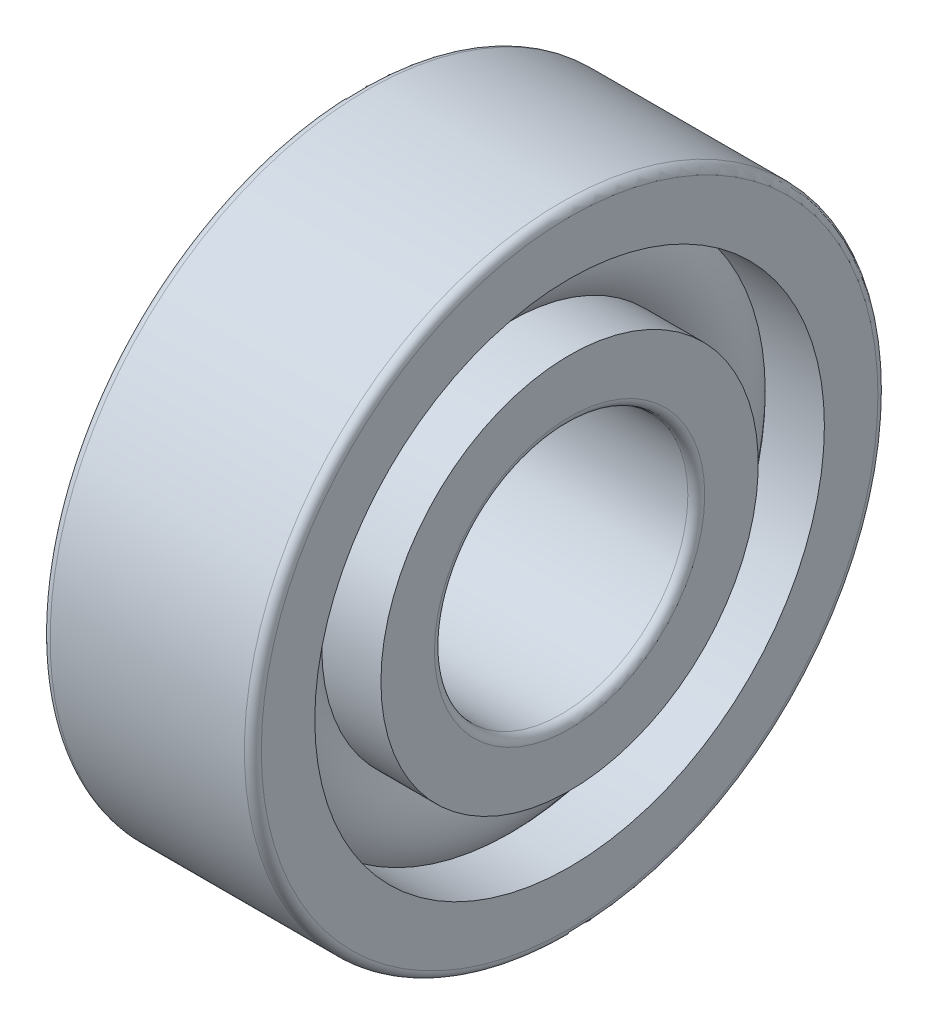
ISO-10303-21;
HEADER;
FILE_DESCRIPTION(('STEP AP214'),'2;1');
FILE_NAME('part.step','',(''),(''),'','','');
FILE_SCHEMA(('AUTOMOTIVE_DESIGN { 1 0 10303 214 1 1 1 1 }'));
ENDSEC;
DATA;
#1=APPLICATION_CONTEXT('core data for automotive mechanical design processes');
#2=APPLICATION_PROTOCOL_DEFINITION('international standard','automotive_design',2000,#1);
#3=PRODUCT_CONTEXT('',#1,'mechanical');
#4=PRODUCT('Part','Part','',(#3));
#5=PRODUCT_RELATED_PRODUCT_CATEGORY('part','',(#4));
#6=PRODUCT_DEFINITION_FORMATION('','',#4);
#7=PRODUCT_DEFINITION_CONTEXT('part definition',#1,'design');
#8=PRODUCT_DEFINITION('design','',#6,#7);
#9=PRODUCT_DEFINITION_SHAPE('','',#8);
#10=(LENGTH_UNIT() NAMED_UNIT(*) SI_UNIT(.MILLI.,.METRE.));
#11=(NAMED_UNIT(*) PLANE_ANGLE_UNIT() SI_UNIT($,.RADIAN.));
#12=(NAMED_UNIT(*) SI_UNIT($,.STERADIAN.) SOLID_ANGLE_UNIT());
#13=UNCERTAINTY_MEASURE_WITH_UNIT(LENGTH_MEASURE(1.E-05),#10,'distance_accuracy_value','');
#14=(GEOMETRIC_REPRESENTATION_CONTEXT(3) GLOBAL_UNCERTAINTY_ASSIGNED_CONTEXT((#13)) GLOBAL_UNIT_ASSIGNED_CONTEXT((#10,
#11,#12)) REPRESENTATION_CONTEXT('',''));
#15=CARTESIAN_POINT('',(0.,0.,0.));
#16=DIRECTION('',(0.,0.,1.));
#17=DIRECTION('',(1.,0.,0.));
#18=AXIS2_PLACEMENT_3D('',#15,#16,#17);
#19=CARTESIAN_POINT('',(2.5,0.,0.));
#20=DIRECTION('',(-1.,0.,0.));
#21=DIRECTION('',(0.,0.,1.));
#22=AXIS2_PLACEMENT_3D('',#19,#20,#21);
#23=TOROIDAL_SURFACE('',#22,5.25,1.35);
#24=CARTESIAN_POINT('',(3.599732240138,0.,0.));
#25=DIRECTION('',(-1.,0.,0.));
#26=DIRECTION('',(0.,0.,1.));
#27=AXIS2_PLACEMENT_3D('',#24,#25,#26);
#28=CIRCLE('',#27,4.467);
#29=CARTESIAN_POINT('',(3.599732240138,0.,4.467));
#30=VERTEX_POINT('',#29);
#31=EDGE_CURVE('P0_E38',#30,#30,#28,.F.);
#32=ORIENTED_EDGE('',*,*,#31,.F.);
#33=EDGE_LOOP('',(#32));
#34=FACE_BOUND('',#33,.T.);
#35=CARTESIAN_POINT('',(1.400267759862,0.,0.));
#36=DIRECTION('',(-1.,0.,0.));
#37=DIRECTION('',(0.,0.,1.));
#38=AXIS2_PLACEMENT_3D('',#35,#36,#37);
#39=CIRCLE('',#38,4.467);
#40=CARTESIAN_POINT('',(1.400267759862,0.,4.467));
#41=VERTEX_POINT('',#40);
#42=EDGE_CURVE('P0_E34',#41,#41,#39,.T.);
#43=ORIENTED_EDGE('',*,*,#42,.F.);
#44=EDGE_LOOP('',(#43));
#45=FACE_BOUND('',#44,.T.);
#46=ADVANCED_FACE('P0_F15',(#34,#45),#23,.F.);
#47=CARTESIAN_POINT('',(5.25,0.,0.));
#48=DIRECTION('',(-1.,0.,0.));
#49=DIRECTION('',(0.,0.,1.));
#50=AXIS2_PLACEMENT_3D('',#47,#48,#49);
#51=CYLINDRICAL_SURFACE('',#50,4.467);
#52=ORIENTED_EDGE('',*,*,#31,.T.);
#53=EDGE_LOOP('',(#52));
#54=FACE_BOUND('',#53,.T.);
#55=CARTESIAN_POINT('',(5.,0.,0.));
#56=DIRECTION('',(-1.,0.,0.));
#57=DIRECTION('',(0.,0.,1.));
#58=AXIS2_PLACEMENT_3D('',#55,#56,#57);
#59=CIRCLE('',#58,4.467);
#60=CARTESIAN_POINT('',(5.,0.,4.467));
#61=VERTEX_POINT('',#60);
#62=EDGE_CURVE('P0_E37',#61,#61,#59,.F.);
#63=ORIENTED_EDGE('',*,*,#62,.F.);
#64=EDGE_LOOP('',(#63));
#65=FACE_BOUND('',#64,.T.);
#66=ADVANCED_FACE('P0_F51',(#54,#65),#51,.T.);
#67=CARTESIAN_POINT('',(5.25,0.,0.));
#68=DIRECTION('',(-1.,0.,0.));
#69=DIRECTION('',(0.,0.,1.));
#70=AXIS2_PLACEMENT_3D('',#67,#68,#69);
#71=CYLINDRICAL_SURFACE('',#70,4.467);
#72=ORIENTED_EDGE('',*,*,#42,.T.);
#73=EDGE_LOOP('',(#72));
#74=FACE_BOUND('',#73,.T.);
#75=CARTESIAN_POINT('',(0.,0.,0.));
#76=DIRECTION('',(-1.,0.,0.));
#77=DIRECTION('',(0.,0.,1.));
#78=AXIS2_PLACEMENT_3D('',#75,#76,#77);
#79=CIRCLE('',#78,4.467);
#80=CARTESIAN_POINT('',(0.,0.,4.467));
#81=VERTEX_POINT('',#80);
#82=EDGE_CURVE('P0_E43',#81,#81,#79,.F.);
#83=ORIENTED_EDGE('',*,*,#82,.T.);
#84=EDGE_LOOP('',(#83));
#85=FACE_BOUND('',#84,.T.);
#86=ADVANCED_FACE('P0_F53',(#74,#85),#71,.T.);
#87=CARTESIAN_POINT('',(5.,0.,0.));
#88=DIRECTION('',(1.,0.,0.));
#89=DIRECTION('',(0.,0.,-1.));
#90=AXIS2_PLACEMENT_3D('',#87,#88,#89);
#91=PLANE('',#90);
#92=ORIENTED_EDGE('',*,*,#62,.T.);
#93=EDGE_LOOP('',(#92));
#94=FACE_BOUND('',#93,.T.);
#95=CARTESIAN_POINT('',(5.,0.,0.));
#96=DIRECTION('',(1.,0.,0.));
#97=DIRECTION('',(0.,0.,-1.));
#98=AXIS2_PLACEMENT_3D('',#95,#96,#97);
#99=CIRCLE('',#98,3.2);
#100=CARTESIAN_POINT('',(5.,0.,-3.2));
#101=VERTEX_POINT('',#100);
#102=EDGE_CURVE('P0_E31',#101,#101,#99,.T.);
#103=ORIENTED_EDGE('',*,*,#102,.F.);
#104=EDGE_LOOP('',(#103));
#105=FACE_BOUND('',#104,.T.);
#106=ADVANCED_FACE('P0_F48',(#94,#105),#91,.T.);
#107=CARTESIAN_POINT('',(0.,0.,0.));
#108=DIRECTION('',(1.,0.,0.));
#109=DIRECTION('',(0.,0.,-1.));
#110=AXIS2_PLACEMENT_3D('',#107,#108,#109);
#111=PLANE('',#110);
#112=ORIENTED_EDGE('',*,*,#82,.F.);
#113=EDGE_LOOP('',(#112));
#114=FACE_BOUND('',#113,.T.);
#115=CARTESIAN_POINT('',(0.,0.,0.));
#116=DIRECTION('',(1.,0.,0.));
#117=DIRECTION('',(0.,0.,-1.));
#118=AXIS2_PLACEMENT_3D('',#115,#116,#117);
#119=CIRCLE('',#118,3.2);
#120=CARTESIAN_POINT('',(0.,0.,-3.2));
#121=VERTEX_POINT('',#120);
#122=EDGE_CURVE('P0_E26',#121,#121,#119,.F.);
#123=ORIENTED_EDGE('',*,*,#122,.F.);
#124=EDGE_LOOP('',(#123));
#125=FACE_BOUND('',#124,.T.);
#126=ADVANCED_FACE('P0_F75',(#114,#125),#111,.F.);
#127=CARTESIAN_POINT('',(4.8,0.,0.));
#128=DIRECTION('',(1.,0.,0.));
#129=DIRECTION('',(0.,0.,-1.));
#130=AXIS2_PLACEMENT_3D('',#127,#128,#129);
#131=TOROIDAL_SURFACE('',#130,3.2,0.2);
#132=ORIENTED_EDGE('',*,*,#102,.T.);
#133=EDGE_LOOP('',(#132));
#134=FACE_BOUND('',#133,.T.);
#135=CARTESIAN_POINT('',(4.8,0.,0.));
#136=DIRECTION('',(1.,0.,0.));
#137=DIRECTION('',(0.,0.,-1.));
#138=AXIS2_PLACEMENT_3D('',#135,#136,#137);
#139=CIRCLE('',#138,3.);
#140=CARTESIAN_POINT('',(4.8,0.,-3.));
#141=VERTEX_POINT('',#140);
#142=EDGE_CURVE('P0_E10',#141,#141,#139,.F.);
#143=ORIENTED_EDGE('',*,*,#142,.T.);
#144=EDGE_LOOP('',(#143));
#145=FACE_BOUND('',#144,.T.);
#146=ADVANCED_FACE('P0_F72',(#134,#145),#131,.T.);
#147=CARTESIAN_POINT('',(0.2,0.,0.));
#148=DIRECTION('',(1.,0.,0.));
#149=DIRECTION('',(0.,0.,-1.));
#150=AXIS2_PLACEMENT_3D('',#147,#148,#149);
#151=TOROIDAL_SURFACE('',#150,3.2,0.2);
#152=CARTESIAN_POINT('',(0.2,0.,0.));
#153=DIRECTION('',(1.,0.,0.));
#154=DIRECTION('',(0.,0.,-1.));
#155=AXIS2_PLACEMENT_3D('',#152,#153,#154);
#156=CIRCLE('',#155,3.);
#157=CARTESIAN_POINT('',(0.2,0.,-3.));
#158=VERTEX_POINT('',#157);
#159=EDGE_CURVE('P0_E22',#158,#158,#156,.T.);
#160=ORIENTED_EDGE('',*,*,#159,.T.);
#161=EDGE_LOOP('',(#160));
#162=FACE_BOUND('',#161,.T.);
#163=ORIENTED_EDGE('',*,*,#122,.T.);
#164=EDGE_LOOP('',(#163));
#165=FACE_BOUND('',#164,.T.);
#166=ADVANCED_FACE('P0_F17',(#162,#165),#151,.T.);
#167=CARTESIAN_POINT('',(-0.25,0.,0.));
#168=DIRECTION('',(1.,0.,0.));
#169=DIRECTION('',(0.,0.,-1.));
#170=AXIS2_PLACEMENT_3D('',#167,#168,#169);
#171=CYLINDRICAL_SURFACE('',#170,3.);
#172=ORIENTED_EDGE('',*,*,#142,.F.);
#173=EDGE_LOOP('',(#172));
#174=FACE_BOUND('',#173,.T.);
#175=ORIENTED_EDGE('',*,*,#159,.F.);
#176=EDGE_LOOP('',(#175));
#177=FACE_BOUND('',#176,.T.);
#178=ADVANCED_FACE('P0_F65',(#174,#177),#171,.F.);
#179=CLOSED_SHELL('',(#46,#66,#86,#106,#126,#146,#166,#178));
#180=MANIFOLD_SOLID_BREP('P0_B1',#179);
#181=CARTESIAN_POINT('',(2.5,0.,0.));
#182=DIRECTION('',(1.,0.,0.));
#183=DIRECTION('',(0.,0.,-1.));
#184=AXIS2_PLACEMENT_3D('',#181,#182,#183);
#185=TOROIDAL_SURFACE('',#184,5.25,1.3365);
#186=CARTESIAN_POINT('',(2.5,0.,-6.5865));
#187=VERTEX_POINT('',#186);
#188=VERTEX_LOOP('',#187);
#189=FACE_BOUND('',#188,.T.);
#190=ADVANCED_FACE('P1_F14',(#189),#185,.T.);
#191=CLOSED_SHELL('',(#190));
#192=CARTESIAN_POINT('',(2.5,0.,0.));
#193=DIRECTION('',(1.,0.,0.));
#194=DIRECTION('',(0.,0.,-1.));
#195=AXIS2_PLACEMENT_3D('',#192,#193,#194);
#196=TOROIDAL_SURFACE('',#195,5.25,1.30977);
#197=CARTESIAN_POINT('',(2.5,0.,-6.55977));
#198=VERTEX_POINT('',#197);
#199=VERTEX_LOOP('',#198);
#200=FACE_BOUND('',#199,.T.);
#201=ADVANCED_FACE('P1_F16',(#200),#196,.F.);
#202=CLOSED_SHELL('',(#201));
#203=ORIENTED_CLOSED_SHELL('',*,#202,.T.);
#204=BREP_WITH_VOIDS('P1_B1',#191,(#203));
#205=CARTESIAN_POINT('',(2.50000000000001,0.,0.));
#206=DIRECTION('',(-1.,0.,0.));
#207=DIRECTION('',(0.,0.,1.));
#208=AXIS2_PLACEMENT_3D('',#205,#206,#207);
#209=TOROIDAL_SURFACE('',#208,5.25000000000001,1.34999999999999);
#210=CARTESIAN_POINT('',(1.400267759862,0.,0.));
#211=DIRECTION('',(-1.,0.,0.));
#212=DIRECTION('',(0.,0.,1.));
#213=AXIS2_PLACEMENT_3D('',#210,#211,#212);
#214=CIRCLE('',#213,6.033);
#215=CARTESIAN_POINT('',(1.400267759862,0.,6.033));
#216=VERTEX_POINT('',#215);
#217=EDGE_CURVE('P2_E38',#216,#216,#214,.T.);
#218=ORIENTED_EDGE('',*,*,#217,.T.);
#219=EDGE_LOOP('',(#218));
#220=FACE_BOUND('',#219,.T.);
#221=CARTESIAN_POINT('',(3.599732240138,0.,0.));
#222=DIRECTION('',(-1.,0.,0.));
#223=DIRECTION('',(0.,0.,1.));
#224=AXIS2_PLACEMENT_3D('',#221,#222,#223);
#225=CIRCLE('',#224,6.033);
#226=CARTESIAN_POINT('',(3.599732240138,0.,6.033));
#227=VERTEX_POINT('',#226);
#228=EDGE_CURVE('P2_E35',#227,#227,#225,.F.);
#229=ORIENTED_EDGE('',*,*,#228,.T.);
#230=EDGE_LOOP('',(#229));
#231=FACE_BOUND('',#230,.T.);
#232=ADVANCED_FACE('P2_F15',(#220,#231),#209,.F.);
#233=CARTESIAN_POINT('',(5.25,0.,0.));
#234=DIRECTION('',(-1.,0.,0.));
#235=DIRECTION('',(0.,0.,1.));
#236=AXIS2_PLACEMENT_3D('',#233,#234,#235);
#237=CYLINDRICAL_SURFACE('',#236,6.033);
#238=ORIENTED_EDGE('',*,*,#217,.F.);
#239=EDGE_LOOP('',(#238));
#240=FACE_BOUND('',#239,.T.);
#241=CARTESIAN_POINT('',(0.,0.,0.));
#242=DIRECTION('',(-1.,0.,0.));
#243=DIRECTION('',(0.,0.,1.));
#244=AXIS2_PLACEMENT_3D('',#241,#242,#243);
#245=CIRCLE('',#244,6.033);
#246=CARTESIAN_POINT('',(0.,0.,6.033));
#247=VERTEX_POINT('',#246);
#248=EDGE_CURVE('P2_E19',#247,#247,#245,.T.);
#249=ORIENTED_EDGE('',*,*,#248,.T.);
#250=EDGE_LOOP('',(#249));
#251=FACE_BOUND('',#250,.T.);
#252=ADVANCED_FACE('P2_F52',(#240,#251),#237,.F.);
#253=CARTESIAN_POINT('',(5.25,0.,0.));
#254=DIRECTION('',(-1.,0.,0.));
#255=DIRECTION('',(0.,0.,1.));
#256=AXIS2_PLACEMENT_3D('',#253,#254,#255);
#257=CYLINDRICAL_SURFACE('',#256,6.033);
#258=ORIENTED_EDGE('',*,*,#228,.F.);
#259=EDGE_LOOP('',(#258));
#260=FACE_BOUND('',#259,.T.);
#261=CARTESIAN_POINT('',(5.,0.,0.));
#262=DIRECTION('',(-1.,0.,0.));
#263=DIRECTION('',(0.,0.,1.));
#264=AXIS2_PLACEMENT_3D('',#261,#262,#263);
#265=CIRCLE('',#264,6.033);
#266=CARTESIAN_POINT('',(5.,0.,6.033));
#267=VERTEX_POINT('',#266);
#268=EDGE_CURVE('P2_E45',#267,#267,#265,.T.);
#269=ORIENTED_EDGE('',*,*,#268,.F.);
#270=EDGE_LOOP('',(#269));
#271=FACE_BOUND('',#270,.T.);
#272=ADVANCED_FACE('P2_F57',(#260,#271),#257,.F.);
#273=CARTESIAN_POINT('',(0.,0.,0.));
#274=DIRECTION('',(1.,0.,0.));
#275=DIRECTION('',(0.,0.,-1.));
#276=AXIS2_PLACEMENT_3D('',#273,#274,#275);
#277=PLANE('',#276);
#278=CARTESIAN_POINT('',(0.,0.,0.));
#279=DIRECTION('',(1.,0.,0.));
#280=DIRECTION('',(0.,0.,-1.));
#281=AXIS2_PLACEMENT_3D('',#278,#279,#280);
#282=CIRCLE('',#281,7.3);
#283=CARTESIAN_POINT('',(0.,0.,-7.3));
#284=VERTEX_POINT('',#283);
#285=EDGE_CURVE('P2_E43',#284,#284,#282,.T.);
#286=ORIENTED_EDGE('',*,*,#285,.F.);
#287=EDGE_LOOP('',(#286));
#288=FACE_BOUND('',#287,.T.);
#289=ORIENTED_EDGE('',*,*,#248,.F.);
#290=EDGE_LOOP('',(#289));
#291=FACE_BOUND('',#290,.T.);
#292=ADVANCED_FACE('P2_F54',(#288,#291),#277,.F.);
#293=CARTESIAN_POINT('',(5.,0.,0.));
#294=DIRECTION('',(1.,0.,0.));
#295=DIRECTION('',(0.,0.,-1.));
#296=AXIS2_PLACEMENT_3D('',#293,#294,#295);
#297=PLANE('',#296);
#298=CARTESIAN_POINT('',(5.,0.,0.));
#299=DIRECTION('',(1.,0.,0.));
#300=DIRECTION('',(0.,0.,-1.));
#301=AXIS2_PLACEMENT_3D('',#298,#299,#300);
#302=CIRCLE('',#301,7.3);
#303=CARTESIAN_POINT('',(5.,0.,-7.3));
#304=VERTEX_POINT('',#303);
#305=EDGE_CURVE('P2_E28',#304,#304,#302,.F.);
#306=ORIENTED_EDGE('',*,*,#305,.F.);
#307=EDGE_LOOP('',(#306));
#308=FACE_BOUND('',#307,.T.);
#309=ORIENTED_EDGE('',*,*,#268,.T.);
#310=EDGE_LOOP('',(#309));
#311=FACE_BOUND('',#310,.T.);
#312=ADVANCED_FACE('P2_F56',(#308,#311),#297,.T.);
#313=CARTESIAN_POINT('',(0.200000000000003,0.,0.));
#314=DIRECTION('',(1.,0.,0.));
#315=DIRECTION('',(0.,0.,-1.));
#316=AXIS2_PLACEMENT_3D('',#313,#314,#315);
#317=TOROIDAL_SURFACE('',#316,7.3,0.200000000000001);
#318=ORIENTED_EDGE('',*,*,#285,.T.);
#319=EDGE_LOOP('',(#318));
#320=FACE_BOUND('',#319,.T.);
#321=CARTESIAN_POINT('',(0.2,0.,0.));
#322=DIRECTION('',(1.,0.,0.));
#323=DIRECTION('',(0.,0.,-1.));
#324=AXIS2_PLACEMENT_3D('',#321,#322,#323);
#325=CIRCLE('',#324,7.5);
#326=CARTESIAN_POINT('',(0.2,0.,-7.5));
#327=VERTEX_POINT('',#326);
#328=EDGE_CURVE('P2_E23',#327,#327,#325,.T.);
#329=ORIENTED_EDGE('',*,*,#328,.F.);
#330=EDGE_LOOP('',(#329));
#331=FACE_BOUND('',#330,.T.);
#332=ADVANCED_FACE('P2_F65',(#320,#331),#317,.T.);
#333=CARTESIAN_POINT('',(4.8,0.,0.));
#334=DIRECTION('',(1.,0.,0.));
#335=DIRECTION('',(0.,0.,-1.));
#336=AXIS2_PLACEMENT_3D('',#333,#334,#335);
#337=TOROIDAL_SURFACE('',#336,7.3,0.2);
#338=ORIENTED_EDGE('',*,*,#305,.T.);
#339=EDGE_LOOP('',(#338));
#340=FACE_BOUND('',#339,.T.);
#341=CARTESIAN_POINT('',(4.8,0.,0.));
#342=DIRECTION('',(1.,0.,0.));
#343=DIRECTION('',(0.,0.,-1.));
#344=AXIS2_PLACEMENT_3D('',#341,#342,#343);
#345=CIRCLE('',#344,7.5);
#346=CARTESIAN_POINT('',(4.8,0.,-7.5));
#347=VERTEX_POINT('',#346);
#348=EDGE_CURVE('P2_E10',#347,#347,#345,.F.);
#349=ORIENTED_EDGE('',*,*,#348,.F.);
#350=EDGE_LOOP('',(#349));
#351=FACE_BOUND('',#350,.T.);
#352=ADVANCED_FACE('P2_F17',(#340,#351),#337,.T.);
#353=CARTESIAN_POINT('',(-0.25,0.,0.));
#354=DIRECTION('',(1.,0.,0.));
#355=DIRECTION('',(0.,0.,-1.));
#356=AXIS2_PLACEMENT_3D('',#353,#354,#355);
#357=CYLINDRICAL_SURFACE('',#356,7.5);
#358=ORIENTED_EDGE('',*,*,#348,.T.);
#359=EDGE_LOOP('',(#358));
#360=FACE_BOUND('',#359,.T.);
#361=ORIENTED_EDGE('',*,*,#328,.T.);
#362=EDGE_LOOP('',(#361));
#363=FACE_BOUND('',#362,.T.);
#364=ADVANCED_FACE('P2_F71',(#360,#363),#357,.T.);
#365=CLOSED_SHELL('',(#232,#252,#272,#292,#312,#332,#352,#364));
#366=MANIFOLD_SOLID_BREP('P2_B1',#365);
#367=ADVANCED_BREP_SHAPE_REPRESENTATION('',(#18,#180,#204,#366),#14);
#368=SHAPE_DEFINITION_REPRESENTATION(#9,#367);
ENDSEC;
END-ISO-10303-21;
